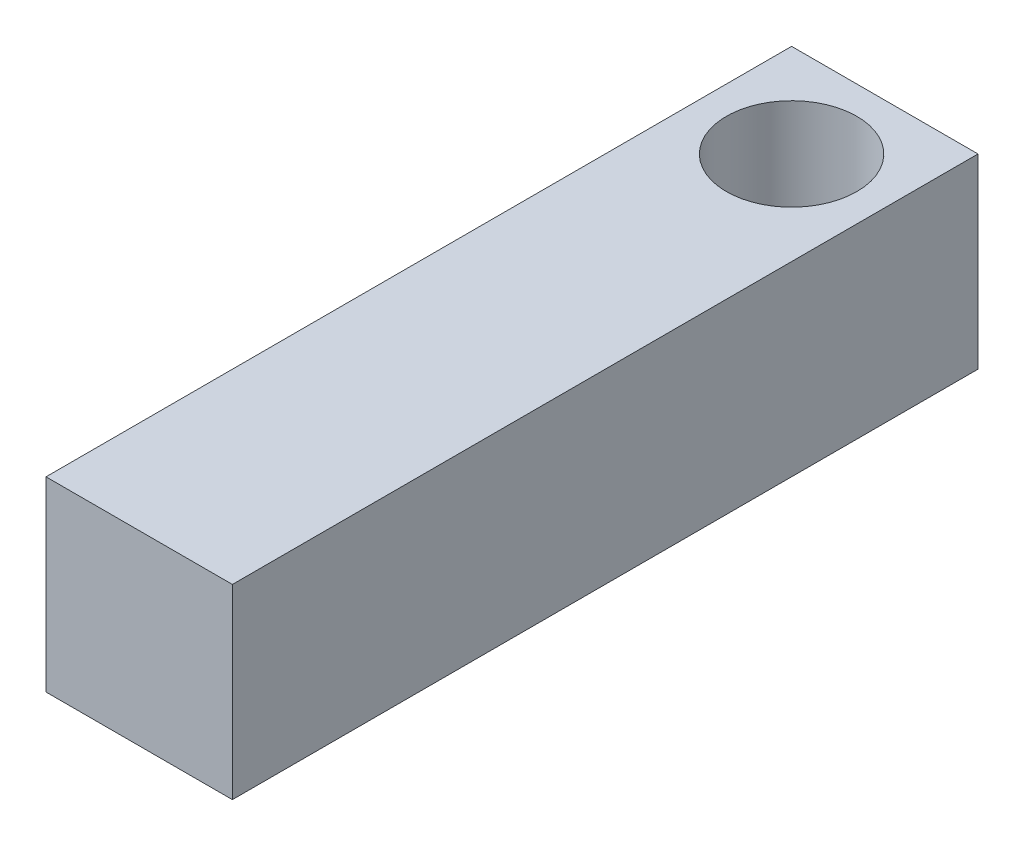
ISO-10303-21;
HEADER;
FILE_DESCRIPTION(('STEP AP214'),'2;1');
FILE_NAME('part.step','',(''),(''),'','','');
FILE_SCHEMA(('AUTOMOTIVE_DESIGN { 1 0 10303 214 1 1 1 1 }'));
ENDSEC;
DATA;
#1=APPLICATION_CONTEXT('core data for automotive mechanical design processes');
#2=APPLICATION_PROTOCOL_DEFINITION('international standard','automotive_design',2000,#1);
#3=PRODUCT_CONTEXT('',#1,'mechanical');
#4=PRODUCT('Part','Part','',(#3));
#5=PRODUCT_RELATED_PRODUCT_CATEGORY('part','',(#4));
#6=PRODUCT_DEFINITION_FORMATION('','',#4);
#7=PRODUCT_DEFINITION_CONTEXT('part definition',#1,'design');
#8=PRODUCT_DEFINITION('design','',#6,#7);
#9=PRODUCT_DEFINITION_SHAPE('','',#8);
#10=(LENGTH_UNIT() NAMED_UNIT(*) SI_UNIT(.MILLI.,.METRE.));
#11=(NAMED_UNIT(*) PLANE_ANGLE_UNIT() SI_UNIT($,.RADIAN.));
#12=(NAMED_UNIT(*) SI_UNIT($,.STERADIAN.) SOLID_ANGLE_UNIT());
#13=UNCERTAINTY_MEASURE_WITH_UNIT(LENGTH_MEASURE(1.E-05),#10,'distance_accuracy_value','');
#14=(GEOMETRIC_REPRESENTATION_CONTEXT(3) GLOBAL_UNCERTAINTY_ASSIGNED_CONTEXT((#13)) GLOBAL_UNIT_ASSIGNED_CONTEXT((#10,
#11,#12)) REPRESENTATION_CONTEXT('',''));
#15=CARTESIAN_POINT('',(0.,0.,0.));
#16=DIRECTION('',(0.,0.,1.));
#17=DIRECTION('',(1.,0.,0.));
#18=AXIS2_PLACEMENT_3D('',#15,#16,#17);
#19=CARTESIAN_POINT('',(0.,5.,20.));
#20=DIRECTION('',(-1.,0.,0.));
#21=DIRECTION('',(0.,-1.,0.));
#22=AXIS2_PLACEMENT_3D('',#19,#20,#21);
#23=PLANE('',#22);
#24=DIRECTION('',(0.,1.,0.));
#25=VECTOR('',#24,1.);
#26=CARTESIAN_POINT('',(0.,5.,0.));
#27=LINE('',#26,#25);
#28=CARTESIAN_POINT('',(0.,0.,0.));
#29=VERTEX_POINT('',#28);
#30=CARTESIAN_POINT('',(0.,5.,0.));
#31=VERTEX_POINT('',#30);
#32=EDGE_CURVE('E96',#29,#31,#27,.T.);
#33=ORIENTED_EDGE('',*,*,#32,.T.);
#34=DIRECTION('',(0.,0.,-1.));
#35=VECTOR('',#34,1.);
#36=CARTESIAN_POINT('',(0.,5.,20.));
#37=LINE('',#36,#35);
#38=CARTESIAN_POINT('',(0.,5.,20.));
#39=VERTEX_POINT('',#38);
#40=EDGE_CURVE('E11',#39,#31,#37,.T.);
#41=ORIENTED_EDGE('',*,*,#40,.F.);
#42=DIRECTION('',(0.,1.,0.));
#43=VECTOR('',#42,1.);
#44=CARTESIAN_POINT('',(0.,5.,20.));
#45=LINE('',#44,#43);
#46=CARTESIAN_POINT('',(0.,0.,20.));
#47=VERTEX_POINT('',#46);
#48=EDGE_CURVE('E84',#47,#39,#45,.T.);
#49=ORIENTED_EDGE('',*,*,#48,.F.);
#50=DIRECTION('',(0.,0.,-1.));
#51=VECTOR('',#50,1.);
#52=CARTESIAN_POINT('',(0.,0.,20.));
#53=LINE('',#52,#51);
#54=EDGE_CURVE('E92',#47,#29,#53,.T.);
#55=ORIENTED_EDGE('',*,*,#54,.T.);
#56=EDGE_LOOP('',(#33,#41,#49,#55));
#57=FACE_BOUND('',#56,.T.);
#58=ADVANCED_FACE('F33',(#57),#23,.F.);
#59=CARTESIAN_POINT('',(-5.,5.,20.));
#60=DIRECTION('',(0.,-1.,0.));
#61=DIRECTION('',(0.,0.,-1.));
#62=AXIS2_PLACEMENT_3D('',#59,#60,#61);
#63=PLANE('',#62);
#64=CARTESIAN_POINT('',(-2.5,5.,2.5));
#65=DIRECTION('',(0.,-1.,0.));
#66=DIRECTION('',(1.,0.,0.));
#67=AXIS2_PLACEMENT_3D('',#64,#65,#66);
#68=CIRCLE('',#67,1.75);
#69=CARTESIAN_POINT('',(-0.750000000000001,5.,2.5));
#70=VERTEX_POINT('',#69);
#71=EDGE_CURVE('E99',#70,#70,#68,.T.);
#72=ORIENTED_EDGE('',*,*,#71,.T.);
#73=EDGE_LOOP('',(#72));
#74=FACE_BOUND('',#73,.T.);
#75=DIRECTION('',(-1.,0.,0.));
#76=VECTOR('',#75,1.);
#77=CARTESIAN_POINT('',(-5.,5.,0.));
#78=LINE('',#77,#76);
#79=CARTESIAN_POINT('',(-5.,5.,0.));
#80=VERTEX_POINT('',#79);
#81=EDGE_CURVE('E88',#31,#80,#78,.T.);
#82=ORIENTED_EDGE('',*,*,#81,.T.);
#83=DIRECTION('',(0.,0.,-1.));
#84=VECTOR('',#83,1.);
#85=CARTESIAN_POINT('',(-5.,5.,20.));
#86=LINE('',#85,#84);
#87=CARTESIAN_POINT('',(-5.,5.,20.));
#88=VERTEX_POINT('',#87);
#89=EDGE_CURVE('E41',#88,#80,#86,.T.);
#90=ORIENTED_EDGE('',*,*,#89,.F.);
#91=DIRECTION('',(-1.,0.,0.));
#92=VECTOR('',#91,1.);
#93=CARTESIAN_POINT('',(-5.,5.,20.));
#94=LINE('',#93,#92);
#95=EDGE_CURVE('E79',#39,#88,#94,.T.);
#96=ORIENTED_EDGE('',*,*,#95,.F.);
#97=ORIENTED_EDGE('',*,*,#40,.T.);
#98=EDGE_LOOP('',(#82,#90,#96,#97));
#99=FACE_BOUND('',#98,.T.);
#100=ADVANCED_FACE('F87',(#74,#99),#63,.F.);
#101=CARTESIAN_POINT('',(-5.,0.,20.));
#102=DIRECTION('',(1.,0.,0.));
#103=DIRECTION('',(0.,1.,0.));
#104=AXIS2_PLACEMENT_3D('',#101,#102,#103);
#105=PLANE('',#104);
#106=DIRECTION('',(0.,-1.,0.));
#107=VECTOR('',#106,1.);
#108=CARTESIAN_POINT('',(-5.,0.,0.));
#109=LINE('',#108,#107);
#110=CARTESIAN_POINT('',(-5.,0.,0.));
#111=VERTEX_POINT('',#110);
#112=EDGE_CURVE('E66',#80,#111,#109,.T.);
#113=ORIENTED_EDGE('',*,*,#112,.T.);
#114=DIRECTION('',(0.,0.,-1.));
#115=VECTOR('',#114,1.);
#116=CARTESIAN_POINT('',(-5.,0.,20.));
#117=LINE('',#116,#115);
#118=CARTESIAN_POINT('',(-5.,0.,20.));
#119=VERTEX_POINT('',#118);
#120=EDGE_CURVE('E89',#119,#111,#117,.T.);
#121=ORIENTED_EDGE('',*,*,#120,.F.);
#122=DIRECTION('',(0.,-1.,0.));
#123=VECTOR('',#122,1.);
#124=CARTESIAN_POINT('',(-5.,0.,20.));
#125=LINE('',#124,#123);
#126=EDGE_CURVE('E82',#88,#119,#125,.T.);
#127=ORIENTED_EDGE('',*,*,#126,.F.);
#128=ORIENTED_EDGE('',*,*,#89,.T.);
#129=EDGE_LOOP('',(#113,#121,#127,#128));
#130=FACE_BOUND('',#129,.T.);
#131=ADVANCED_FACE('F90',(#130),#105,.F.);
#132=CARTESIAN_POINT('',(0.,0.,20.));
#133=DIRECTION('',(0.,1.,0.));
#134=DIRECTION('',(-1.,0.,0.));
#135=AXIS2_PLACEMENT_3D('',#132,#133,#134);
#136=PLANE('',#135);
#137=CARTESIAN_POINT('',(-2.5,0.,2.5));
#138=DIRECTION('',(0.,-1.,0.));
#139=DIRECTION('',(1.,0.,0.));
#140=AXIS2_PLACEMENT_3D('',#137,#138,#139);
#141=CIRCLE('',#140,1.75);
#142=CARTESIAN_POINT('',(-0.75,0.,2.5));
#143=VERTEX_POINT('',#142);
#144=EDGE_CURVE('E110',#143,#143,#141,.T.);
#145=ORIENTED_EDGE('',*,*,#144,.F.);
#146=EDGE_LOOP('',(#145));
#147=FACE_BOUND('',#146,.T.);
#148=DIRECTION('',(1.,0.,0.));
#149=VECTOR('',#148,1.);
#150=CARTESIAN_POINT('',(0.,0.,0.));
#151=LINE('',#150,#149);
#152=EDGE_CURVE('E72',#111,#29,#151,.T.);
#153=ORIENTED_EDGE('',*,*,#152,.T.);
#154=ORIENTED_EDGE('',*,*,#54,.F.);
#155=DIRECTION('',(1.,0.,0.));
#156=VECTOR('',#155,1.);
#157=CARTESIAN_POINT('',(0.,0.,20.));
#158=LINE('',#157,#156);
#159=EDGE_CURVE('E49',#119,#47,#158,.T.);
#160=ORIENTED_EDGE('',*,*,#159,.F.);
#161=ORIENTED_EDGE('',*,*,#120,.T.);
#162=EDGE_LOOP('',(#153,#154,#160,#161));
#163=FACE_BOUND('',#162,.T.);
#164=ADVANCED_FACE('F104',(#147,#163),#136,.F.);
#165=CARTESIAN_POINT('',(0.,0.,20.));
#166=DIRECTION('',(0.,0.,-1.));
#167=DIRECTION('',(-1.,0.,0.));
#168=AXIS2_PLACEMENT_3D('',#165,#166,#167);
#169=PLANE('',#168);
#170=ORIENTED_EDGE('',*,*,#48,.T.);
#171=ORIENTED_EDGE('',*,*,#95,.T.);
#172=ORIENTED_EDGE('',*,*,#126,.T.);
#173=ORIENTED_EDGE('',*,*,#159,.T.);
#174=EDGE_LOOP('',(#170,#171,#172,#173));
#175=FACE_BOUND('',#174,.T.);
#176=ADVANCED_FACE('F80',(#175),#169,.F.);
#177=CARTESIAN_POINT('',(0.,0.,0.));
#178=DIRECTION('',(0.,0.,-1.));
#179=DIRECTION('',(-1.,0.,0.));
#180=AXIS2_PLACEMENT_3D('',#177,#178,#179);
#181=PLANE('',#180);
#182=ORIENTED_EDGE('',*,*,#32,.F.);
#183=ORIENTED_EDGE('',*,*,#152,.F.);
#184=ORIENTED_EDGE('',*,*,#112,.F.);
#185=ORIENTED_EDGE('',*,*,#81,.F.);
#186=EDGE_LOOP('',(#182,#183,#184,#185));
#187=FACE_BOUND('',#186,.T.);
#188=ADVANCED_FACE('F107',(#187),#181,.T.);
#189=CARTESIAN_POINT('',(-2.5,5.,2.5));
#190=DIRECTION('',(0.,-1.,0.));
#191=DIRECTION('',(1.,0.,0.));
#192=AXIS2_PLACEMENT_3D('',#189,#190,#191);
#193=CYLINDRICAL_SURFACE('',#192,1.75);
#194=ORIENTED_EDGE('',*,*,#71,.F.);
#195=EDGE_LOOP('',(#194));
#196=FACE_BOUND('',#195,.T.);
#197=ORIENTED_EDGE('',*,*,#144,.T.);
#198=EDGE_LOOP('',(#197));
#199=FACE_BOUND('',#198,.T.);
#200=ADVANCED_FACE('F117',(#196,#199),#193,.F.);
#201=CLOSED_SHELL('',(#58,#100,#131,#164,#176,#188,#200));
#202=MANIFOLD_SOLID_BREP('B2',#201);
#203=ADVANCED_BREP_SHAPE_REPRESENTATION('',(#18,#202),#14);
#204=SHAPE_DEFINITION_REPRESENTATION(#9,#203);
ENDSEC;
END-ISO-10303-21;
